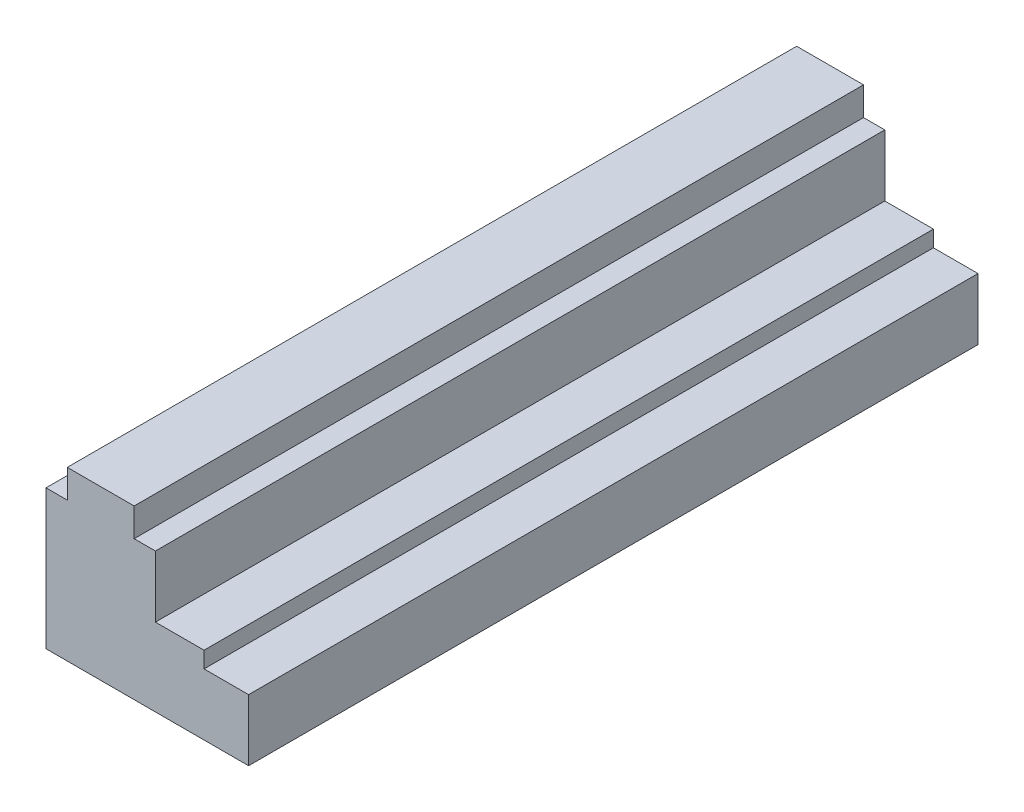
ISO-10303-21;
HEADER;
FILE_DESCRIPTION(('STEP AP214'),'2;1');
FILE_NAME('part.step','',(''),(''),'','','');
FILE_SCHEMA(('AUTOMOTIVE_DESIGN { 1 0 10303 214 1 1 1 1 }'));
ENDSEC;
DATA;
#1=APPLICATION_CONTEXT('core data for automotive mechanical design processes');
#2=APPLICATION_PROTOCOL_DEFINITION('international standard','automotive_design',2000,#1);
#3=PRODUCT_CONTEXT('',#1,'mechanical');
#4=PRODUCT('Part','Part','',(#3));
#5=PRODUCT_RELATED_PRODUCT_CATEGORY('part','',(#4));
#6=PRODUCT_DEFINITION_FORMATION('','',#4);
#7=PRODUCT_DEFINITION_CONTEXT('part definition',#1,'design');
#8=PRODUCT_DEFINITION('design','',#6,#7);
#9=PRODUCT_DEFINITION_SHAPE('','',#8);
#10=(LENGTH_UNIT() NAMED_UNIT(*) SI_UNIT(.MILLI.,.METRE.));
#11=(NAMED_UNIT(*) PLANE_ANGLE_UNIT() SI_UNIT($,.RADIAN.));
#12=(NAMED_UNIT(*) SI_UNIT($,.STERADIAN.) SOLID_ANGLE_UNIT());
#13=UNCERTAINTY_MEASURE_WITH_UNIT(LENGTH_MEASURE(1.E-05),#10,'distance_accuracy_value','');
#14=(GEOMETRIC_REPRESENTATION_CONTEXT(3) GLOBAL_UNCERTAINTY_ASSIGNED_CONTEXT((#13)) GLOBAL_UNIT_ASSIGNED_CONTEXT((#10,
#11,#12)) REPRESENTATION_CONTEXT('',''));
#15=CARTESIAN_POINT('',(0.,0.,0.));
#16=DIRECTION('',(0.,0.,1.));
#17=DIRECTION('',(1.,0.,0.));
#18=AXIS2_PLACEMENT_3D('',#15,#16,#17);
#19=CARTESIAN_POINT('',(25.,0.,90.));
#20=DIRECTION('',(1.,0.,0.));
#21=DIRECTION('',(0.,0.,1.));
#22=AXIS2_PLACEMENT_3D('',#19,#20,#21);
#23=PLANE('',#22);
#24=DIRECTION('',(0.,1.,0.));
#25=VECTOR('',#24,1.);
#26=CARTESIAN_POINT('',(25.,0.,0.));
#27=LINE('',#26,#25);
#28=CARTESIAN_POINT('',(25.,0.,0.));
#29=VERTEX_POINT('',#28);
#30=CARTESIAN_POINT('',(25.,7.59999999999999,0.));
#31=VERTEX_POINT('',#30);
#32=EDGE_CURVE('E159',#29,#31,#27,.T.);
#33=ORIENTED_EDGE('',*,*,#32,.T.);
#34=DIRECTION('',(0.,0.,-1.));
#35=VECTOR('',#34,1.);
#36=CARTESIAN_POINT('',(25.,7.59999999999999,90.));
#37=LINE('',#36,#35);
#38=CARTESIAN_POINT('',(25.,7.59999999999999,90.));
#39=VERTEX_POINT('',#38);
#40=EDGE_CURVE('E42',#39,#31,#37,.T.);
#41=ORIENTED_EDGE('',*,*,#40,.F.);
#42=DIRECTION('',(0.,1.,0.));
#43=VECTOR('',#42,1.);
#44=CARTESIAN_POINT('',(25.,0.,90.));
#45=LINE('',#44,#43);
#46=CARTESIAN_POINT('',(25.,0.,90.));
#47=VERTEX_POINT('',#46);
#48=EDGE_CURVE('E180',#47,#39,#45,.T.);
#49=ORIENTED_EDGE('',*,*,#48,.F.);
#50=DIRECTION('',(0.,0.,-1.));
#51=VECTOR('',#50,1.);
#52=CARTESIAN_POINT('',(25.,0.,90.));
#53=LINE('',#52,#51);
#54=EDGE_CURVE('E11',#47,#29,#53,.T.);
#55=ORIENTED_EDGE('',*,*,#54,.T.);
#56=EDGE_LOOP('',(#33,#41,#49,#55));
#57=FACE_BOUND('',#56,.T.);
#58=ADVANCED_FACE('F39',(#57),#23,.T.);
#59=CARTESIAN_POINT('',(25.,0.,90.));
#60=DIRECTION('',(0.,1.,0.));
#61=DIRECTION('',(0.,0.,1.));
#62=AXIS2_PLACEMENT_3D('',#59,#60,#61);
#63=PLANE('',#62);
#64=DIRECTION('',(-1.,0.,0.));
#65=VECTOR('',#64,1.);
#66=CARTESIAN_POINT('',(25.,0.,0.));
#67=LINE('',#66,#65);
#68=CARTESIAN_POINT('',(0.,0.,0.));
#69=VERTEX_POINT('',#68);
#70=EDGE_CURVE('E104',#29,#69,#67,.T.);
#71=ORIENTED_EDGE('',*,*,#70,.F.);
#72=ORIENTED_EDGE('',*,*,#54,.F.);
#73=DIRECTION('',(-1.,0.,0.));
#74=VECTOR('',#73,1.);
#75=CARTESIAN_POINT('',(25.,0.,90.));
#76=LINE('',#75,#74);
#77=CARTESIAN_POINT('',(0.,0.,90.));
#78=VERTEX_POINT('',#77);
#79=EDGE_CURVE('E57',#47,#78,#76,.T.);
#80=ORIENTED_EDGE('',*,*,#79,.T.);
#81=DIRECTION('',(0.,0.,-1.));
#82=VECTOR('',#81,1.);
#83=CARTESIAN_POINT('',(0.,0.,90.));
#84=LINE('',#83,#82);
#85=EDGE_CURVE('E48',#78,#69,#84,.T.);
#86=ORIENTED_EDGE('',*,*,#85,.T.);
#87=EDGE_LOOP('',(#71,#72,#80,#86));
#88=FACE_BOUND('',#87,.T.);
#89=ADVANCED_FACE('F266',(#88),#63,.F.);
#90=CARTESIAN_POINT('',(0.,17.2,90.));
#91=DIRECTION('',(-1.,0.,0.));
#92=DIRECTION('',(0.,1.,0.));
#93=AXIS2_PLACEMENT_3D('',#90,#91,#92);
#94=PLANE('',#93);
#95=DIRECTION('',(0.,-1.,0.));
#96=VECTOR('',#95,1.);
#97=CARTESIAN_POINT('',(0.,17.2,0.));
#98=LINE('',#97,#96);
#99=CARTESIAN_POINT('',(0.,17.2,0.));
#100=VERTEX_POINT('',#99);
#101=EDGE_CURVE('E98',#100,#69,#98,.T.);
#102=ORIENTED_EDGE('',*,*,#101,.T.);
#103=ORIENTED_EDGE('',*,*,#85,.F.);
#104=DIRECTION('',(0.,-1.,0.));
#105=VECTOR('',#104,1.);
#106=CARTESIAN_POINT('',(0.,17.2,90.));
#107=LINE('',#106,#105);
#108=CARTESIAN_POINT('',(0.,17.2,90.));
#109=VERTEX_POINT('',#108);
#110=EDGE_CURVE('E141',#109,#78,#107,.T.);
#111=ORIENTED_EDGE('',*,*,#110,.F.);
#112=DIRECTION('',(0.,0.,-1.));
#113=VECTOR('',#112,1.);
#114=CARTESIAN_POINT('',(0.,17.2,90.));
#115=LINE('',#114,#113);
#116=EDGE_CURVE('E148',#109,#100,#115,.T.);
#117=ORIENTED_EDGE('',*,*,#116,.T.);
#118=EDGE_LOOP('',(#102,#103,#111,#117));
#119=FACE_BOUND('',#118,.T.);
#120=ADVANCED_FACE('F154',(#119),#94,.T.);
#121=CARTESIAN_POINT('',(2.62500000000001,17.2,90.));
#122=DIRECTION('',(0.,1.,0.));
#123=DIRECTION('',(0.,0.,1.));
#124=AXIS2_PLACEMENT_3D('',#121,#122,#123);
#125=PLANE('',#124);
#126=DIRECTION('',(-1.,0.,0.));
#127=VECTOR('',#126,1.);
#128=CARTESIAN_POINT('',(2.62500000000001,17.2,0.));
#129=LINE('',#128,#127);
#130=CARTESIAN_POINT('',(2.62500000000001,17.2,0.));
#131=VERTEX_POINT('',#130);
#132=EDGE_CURVE('E151',#131,#100,#129,.T.);
#133=ORIENTED_EDGE('',*,*,#132,.T.);
#134=ORIENTED_EDGE('',*,*,#116,.F.);
#135=DIRECTION('',(-1.,0.,0.));
#136=VECTOR('',#135,1.);
#137=CARTESIAN_POINT('',(2.62500000000001,17.2,90.));
#138=LINE('',#137,#136);
#139=CARTESIAN_POINT('',(2.62500000000001,17.2,90.));
#140=VERTEX_POINT('',#139);
#141=EDGE_CURVE('E137',#140,#109,#138,.T.);
#142=ORIENTED_EDGE('',*,*,#141,.F.);
#143=DIRECTION('',(0.,0.,-1.));
#144=VECTOR('',#143,1.);
#145=CARTESIAN_POINT('',(2.62500000000001,17.2,90.));
#146=LINE('',#145,#144);
#147=EDGE_CURVE('E152',#140,#131,#146,.T.);
#148=ORIENTED_EDGE('',*,*,#147,.T.);
#149=EDGE_LOOP('',(#133,#134,#142,#148));
#150=FACE_BOUND('',#149,.T.);
#151=ADVANCED_FACE('F149',(#150),#125,.T.);
#152=CARTESIAN_POINT('',(2.62500000000001,20.7,90.));
#153=DIRECTION('',(-1.,0.,0.));
#154=DIRECTION('',(0.,1.,0.));
#155=AXIS2_PLACEMENT_3D('',#152,#153,#154);
#156=PLANE('',#155);
#157=DIRECTION('',(0.,-1.,0.));
#158=VECTOR('',#157,1.);
#159=CARTESIAN_POINT('',(2.62500000000001,20.7,0.));
#160=LINE('',#159,#158);
#161=CARTESIAN_POINT('',(2.62500000000001,20.7,0.));
#162=VERTEX_POINT('',#161);
#163=EDGE_CURVE('E176',#162,#131,#160,.T.);
#164=ORIENTED_EDGE('',*,*,#163,.T.);
#165=ORIENTED_EDGE('',*,*,#147,.F.);
#166=DIRECTION('',(0.,-1.,0.));
#167=VECTOR('',#166,1.);
#168=CARTESIAN_POINT('',(2.62500000000001,20.7,90.));
#169=LINE('',#168,#167);
#170=CARTESIAN_POINT('',(2.62500000000001,20.7,90.));
#171=VERTEX_POINT('',#170);
#172=EDGE_CURVE('E143',#171,#140,#169,.T.);
#173=ORIENTED_EDGE('',*,*,#172,.F.);
#174=DIRECTION('',(0.,0.,-1.));
#175=VECTOR('',#174,1.);
#176=CARTESIAN_POINT('',(2.62500000000001,20.7,90.));
#177=LINE('',#176,#175);
#178=EDGE_CURVE('E184',#171,#162,#177,.T.);
#179=ORIENTED_EDGE('',*,*,#178,.T.);
#180=EDGE_LOOP('',(#164,#165,#173,#179));
#181=FACE_BOUND('',#180,.T.);
#182=ADVANCED_FACE('F244',(#181),#156,.T.);
#183=CARTESIAN_POINT('',(10.875,20.7,90.));
#184=DIRECTION('',(0.,1.,0.));
#185=DIRECTION('',(1.,0.,0.));
#186=AXIS2_PLACEMENT_3D('',#183,#184,#185);
#187=PLANE('',#186);
#188=DIRECTION('',(-1.,0.,0.));
#189=VECTOR('',#188,1.);
#190=CARTESIAN_POINT('',(10.875,20.7,0.));
#191=LINE('',#190,#189);
#192=CARTESIAN_POINT('',(10.875,20.7,0.));
#193=VERTEX_POINT('',#192);
#194=EDGE_CURVE('E174',#193,#162,#191,.T.);
#195=ORIENTED_EDGE('',*,*,#194,.T.);
#196=ORIENTED_EDGE('',*,*,#178,.F.);
#197=DIRECTION('',(-1.,0.,0.));
#198=VECTOR('',#197,1.);
#199=CARTESIAN_POINT('',(10.875,20.7,90.));
#200=LINE('',#199,#198);
#201=CARTESIAN_POINT('',(10.875,20.7,90.));
#202=VERTEX_POINT('',#201);
#203=EDGE_CURVE('E234',#202,#171,#200,.T.);
#204=ORIENTED_EDGE('',*,*,#203,.F.);
#205=DIRECTION('',(0.,0.,-1.));
#206=VECTOR('',#205,1.);
#207=CARTESIAN_POINT('',(10.875,20.7,90.));
#208=LINE('',#207,#206);
#209=EDGE_CURVE('E187',#202,#193,#208,.T.);
#210=ORIENTED_EDGE('',*,*,#209,.T.);
#211=EDGE_LOOP('',(#195,#196,#204,#210));
#212=FACE_BOUND('',#211,.T.);
#213=ADVANCED_FACE('F240',(#212),#187,.T.);
#214=CARTESIAN_POINT('',(10.875,17.2,90.));
#215=DIRECTION('',(1.,0.,0.));
#216=DIRECTION('',(0.,-1.,0.));
#217=AXIS2_PLACEMENT_3D('',#214,#215,#216);
#218=PLANE('',#217);
#219=DIRECTION('',(0.,1.,0.));
#220=VECTOR('',#219,1.);
#221=CARTESIAN_POINT('',(10.875,17.2,0.));
#222=LINE('',#221,#220);
#223=CARTESIAN_POINT('',(10.875,17.2,0.));
#224=VERTEX_POINT('',#223);
#225=EDGE_CURVE('E172',#224,#193,#222,.T.);
#226=ORIENTED_EDGE('',*,*,#225,.T.);
#227=ORIENTED_EDGE('',*,*,#209,.F.);
#228=DIRECTION('',(0.,1.,0.));
#229=VECTOR('',#228,1.);
#230=CARTESIAN_POINT('',(10.875,17.2,90.));
#231=LINE('',#230,#229);
#232=CARTESIAN_POINT('',(10.875,17.2,90.));
#233=VERTEX_POINT('',#232);
#234=EDGE_CURVE('E232',#233,#202,#231,.T.);
#235=ORIENTED_EDGE('',*,*,#234,.F.);
#236=DIRECTION('',(0.,0.,-1.));
#237=VECTOR('',#236,1.);
#238=CARTESIAN_POINT('',(10.875,17.2,90.));
#239=LINE('',#238,#237);
#240=EDGE_CURVE('E190',#233,#224,#239,.T.);
#241=ORIENTED_EDGE('',*,*,#240,.T.);
#242=EDGE_LOOP('',(#226,#227,#235,#241));
#243=FACE_BOUND('',#242,.T.);
#244=ADVANCED_FACE('F248',(#243),#218,.T.);
#245=CARTESIAN_POINT('',(13.5,17.2,90.));
#246=DIRECTION('',(0.,1.,0.));
#247=DIRECTION('',(0.,0.,1.));
#248=AXIS2_PLACEMENT_3D('',#245,#246,#247);
#249=PLANE('',#248);
#250=DIRECTION('',(-1.,0.,0.));
#251=VECTOR('',#250,1.);
#252=CARTESIAN_POINT('',(13.5,17.2,0.));
#253=LINE('',#252,#251);
#254=CARTESIAN_POINT('',(13.5,17.2,0.));
#255=VERTEX_POINT('',#254);
#256=EDGE_CURVE('E170',#255,#224,#253,.T.);
#257=ORIENTED_EDGE('',*,*,#256,.T.);
#258=ORIENTED_EDGE('',*,*,#240,.F.);
#259=DIRECTION('',(-1.,0.,0.));
#260=VECTOR('',#259,1.);
#261=CARTESIAN_POINT('',(13.5,17.2,90.));
#262=LINE('',#261,#260);
#263=CARTESIAN_POINT('',(13.5,17.2,90.));
#264=VERTEX_POINT('',#263);
#265=EDGE_CURVE('E226',#264,#233,#262,.T.);
#266=ORIENTED_EDGE('',*,*,#265,.F.);
#267=DIRECTION('',(0.,0.,-1.));
#268=VECTOR('',#267,1.);
#269=CARTESIAN_POINT('',(13.5,17.2,90.));
#270=LINE('',#269,#268);
#271=EDGE_CURVE('E193',#264,#255,#270,.T.);
#272=ORIENTED_EDGE('',*,*,#271,.T.);
#273=EDGE_LOOP('',(#257,#258,#266,#272));
#274=FACE_BOUND('',#273,.T.);
#275=ADVANCED_FACE('F252',(#274),#249,.T.);
#276=CARTESIAN_POINT('',(13.5,9.6,90.));
#277=DIRECTION('',(1.,0.,0.));
#278=DIRECTION('',(0.,-1.,0.));
#279=AXIS2_PLACEMENT_3D('',#276,#277,#278);
#280=PLANE('',#279);
#281=DIRECTION('',(0.,1.,0.));
#282=VECTOR('',#281,1.);
#283=CARTESIAN_POINT('',(13.5,9.6,0.));
#284=LINE('',#283,#282);
#285=CARTESIAN_POINT('',(13.5,9.6,0.));
#286=VERTEX_POINT('',#285);
#287=EDGE_CURVE('E168',#286,#255,#284,.T.);
#288=ORIENTED_EDGE('',*,*,#287,.T.);
#289=ORIENTED_EDGE('',*,*,#271,.F.);
#290=DIRECTION('',(0.,1.,0.));
#291=VECTOR('',#290,1.);
#292=CARTESIAN_POINT('',(13.5,9.6,90.));
#293=LINE('',#292,#291);
#294=CARTESIAN_POINT('',(13.5,9.6,90.));
#295=VERTEX_POINT('',#294);
#296=EDGE_CURVE('E223',#295,#264,#293,.T.);
#297=ORIENTED_EDGE('',*,*,#296,.F.);
#298=DIRECTION('',(0.,0.,-1.));
#299=VECTOR('',#298,1.);
#300=CARTESIAN_POINT('',(13.5,9.6,90.));
#301=LINE('',#300,#299);
#302=EDGE_CURVE('E196',#295,#286,#301,.T.);
#303=ORIENTED_EDGE('',*,*,#302,.T.);
#304=EDGE_LOOP('',(#288,#289,#297,#303));
#305=FACE_BOUND('',#304,.T.);
#306=ADVANCED_FACE('F255',(#305),#280,.T.);
#307=CARTESIAN_POINT('',(19.5,9.59999999999999,90.));
#308=DIRECTION('',(0.,1.,0.));
#309=DIRECTION('',(0.,0.,1.));
#310=AXIS2_PLACEMENT_3D('',#307,#308,#309);
#311=PLANE('',#310);
#312=DIRECTION('',(-1.,0.,0.));
#313=VECTOR('',#312,1.);
#314=CARTESIAN_POINT('',(19.5,9.59999999999999,0.));
#315=LINE('',#314,#313);
#316=CARTESIAN_POINT('',(19.5,9.59999999999999,0.));
#317=VERTEX_POINT('',#316);
#318=EDGE_CURVE('E166',#317,#286,#315,.T.);
#319=ORIENTED_EDGE('',*,*,#318,.T.);
#320=ORIENTED_EDGE('',*,*,#302,.F.);
#321=DIRECTION('',(-1.,0.,0.));
#322=VECTOR('',#321,1.);
#323=CARTESIAN_POINT('',(19.5,9.59999999999999,90.));
#324=LINE('',#323,#322);
#325=CARTESIAN_POINT('',(19.5,9.59999999999999,90.));
#326=VERTEX_POINT('',#325);
#327=EDGE_CURVE('E221',#326,#295,#324,.T.);
#328=ORIENTED_EDGE('',*,*,#327,.F.);
#329=DIRECTION('',(0.,0.,-1.));
#330=VECTOR('',#329,1.);
#331=CARTESIAN_POINT('',(19.5,9.59999999999999,90.));
#332=LINE('',#331,#330);
#333=EDGE_CURVE('E199',#326,#317,#332,.T.);
#334=ORIENTED_EDGE('',*,*,#333,.T.);
#335=EDGE_LOOP('',(#319,#320,#328,#334));
#336=FACE_BOUND('',#335,.T.);
#337=ADVANCED_FACE('F219',(#336),#311,.T.);
#338=CARTESIAN_POINT('',(19.5,7.59999999999999,90.));
#339=DIRECTION('',(1.,0.,0.));
#340=DIRECTION('',(0.,0.,1.));
#341=AXIS2_PLACEMENT_3D('',#338,#339,#340);
#342=PLANE('',#341);
#343=DIRECTION('',(0.,1.,0.));
#344=VECTOR('',#343,1.);
#345=CARTESIAN_POINT('',(19.5,7.59999999999999,0.));
#346=LINE('',#345,#344);
#347=CARTESIAN_POINT('',(19.5,7.59999999999999,0.));
#348=VERTEX_POINT('',#347);
#349=EDGE_CURVE('E164',#348,#317,#346,.T.);
#350=ORIENTED_EDGE('',*,*,#349,.T.);
#351=ORIENTED_EDGE('',*,*,#333,.F.);
#352=DIRECTION('',(0.,1.,0.));
#353=VECTOR('',#352,1.);
#354=CARTESIAN_POINT('',(19.5,7.59999999999999,90.));
#355=LINE('',#354,#353);
#356=CARTESIAN_POINT('',(19.5,7.59999999999999,90.));
#357=VERTEX_POINT('',#356);
#358=EDGE_CURVE('E224',#357,#326,#355,.T.);
#359=ORIENTED_EDGE('',*,*,#358,.F.);
#360=DIRECTION('',(0.,0.,-1.));
#361=VECTOR('',#360,1.);
#362=CARTESIAN_POINT('',(19.5,7.59999999999999,90.));
#363=LINE('',#362,#361);
#364=EDGE_CURVE('E201',#357,#348,#363,.T.);
#365=ORIENTED_EDGE('',*,*,#364,.T.);
#366=EDGE_LOOP('',(#350,#351,#359,#365));
#367=FACE_BOUND('',#366,.T.);
#368=ADVANCED_FACE('F216',(#367),#342,.T.);
#369=CARTESIAN_POINT('',(25.,7.59999999999999,90.));
#370=DIRECTION('',(0.,1.,0.));
#371=DIRECTION('',(0.,0.,1.));
#372=AXIS2_PLACEMENT_3D('',#369,#370,#371);
#373=PLANE('',#372);
#374=DIRECTION('',(-1.,0.,0.));
#375=VECTOR('',#374,1.);
#376=CARTESIAN_POINT('',(25.,7.59999999999999,0.));
#377=LINE('',#376,#375);
#378=EDGE_CURVE('E162',#31,#348,#377,.T.);
#379=ORIENTED_EDGE('',*,*,#378,.T.);
#380=ORIENTED_EDGE('',*,*,#364,.F.);
#381=DIRECTION('',(-1.,0.,0.));
#382=VECTOR('',#381,1.);
#383=CARTESIAN_POINT('',(25.,7.59999999999999,90.));
#384=LINE('',#383,#382);
#385=EDGE_CURVE('E112',#39,#357,#384,.T.);
#386=ORIENTED_EDGE('',*,*,#385,.F.);
#387=ORIENTED_EDGE('',*,*,#40,.T.);
#388=EDGE_LOOP('',(#379,#380,#386,#387));
#389=FACE_BOUND('',#388,.T.);
#390=ADVANCED_FACE('F207',(#389),#373,.T.);
#391=CARTESIAN_POINT('',(0.,0.,90.));
#392=DIRECTION('',(0.,0.,-1.));
#393=DIRECTION('',(1.,0.,0.));
#394=AXIS2_PLACEMENT_3D('',#391,#392,#393);
#395=PLANE('',#394);
#396=ORIENTED_EDGE('',*,*,#48,.T.);
#397=ORIENTED_EDGE('',*,*,#385,.T.);
#398=ORIENTED_EDGE('',*,*,#358,.T.);
#399=ORIENTED_EDGE('',*,*,#327,.T.);
#400=ORIENTED_EDGE('',*,*,#296,.T.);
#401=ORIENTED_EDGE('',*,*,#265,.T.);
#402=ORIENTED_EDGE('',*,*,#234,.T.);
#403=ORIENTED_EDGE('',*,*,#203,.T.);
#404=ORIENTED_EDGE('',*,*,#172,.T.);
#405=ORIENTED_EDGE('',*,*,#141,.T.);
#406=ORIENTED_EDGE('',*,*,#110,.T.);
#407=ORIENTED_EDGE('',*,*,#79,.F.);
#408=EDGE_LOOP('',(#396,#397,#398,#399,#400,#401,#402,#403,#404,#405,#406,#407));
#409=FACE_BOUND('',#408,.T.);
#410=ADVANCED_FACE('F139',(#409),#395,.F.);
#411=CARTESIAN_POINT('',(0.,0.,0.));
#412=DIRECTION('',(0.,0.,-1.));
#413=DIRECTION('',(1.,0.,0.));
#414=AXIS2_PLACEMENT_3D('',#411,#412,#413);
#415=PLANE('',#414);
#416=ORIENTED_EDGE('',*,*,#32,.F.);
#417=ORIENTED_EDGE('',*,*,#70,.T.);
#418=ORIENTED_EDGE('',*,*,#101,.F.);
#419=ORIENTED_EDGE('',*,*,#132,.F.);
#420=ORIENTED_EDGE('',*,*,#163,.F.);
#421=ORIENTED_EDGE('',*,*,#194,.F.);
#422=ORIENTED_EDGE('',*,*,#225,.F.);
#423=ORIENTED_EDGE('',*,*,#256,.F.);
#424=ORIENTED_EDGE('',*,*,#287,.F.);
#425=ORIENTED_EDGE('',*,*,#318,.F.);
#426=ORIENTED_EDGE('',*,*,#349,.F.);
#427=ORIENTED_EDGE('',*,*,#378,.F.);
#428=EDGE_LOOP('',(#416,#417,#418,#419,#420,#421,#422,#423,#424,#425,#426,#427));
#429=FACE_BOUND('',#428,.T.);
#430=ADVANCED_FACE('F212',(#429),#415,.T.);
#431=CLOSED_SHELL('',(#58,#89,#120,#151,#182,#213,#244,#275,#306,#337,#368,#390,#410,#430));
#432=MANIFOLD_SOLID_BREP('B2',#431);
#433=ADVANCED_BREP_SHAPE_REPRESENTATION('',(#18,#432),#14);
#434=SHAPE_DEFINITION_REPRESENTATION(#9,#433);
ENDSEC;
END-ISO-10303-21;
